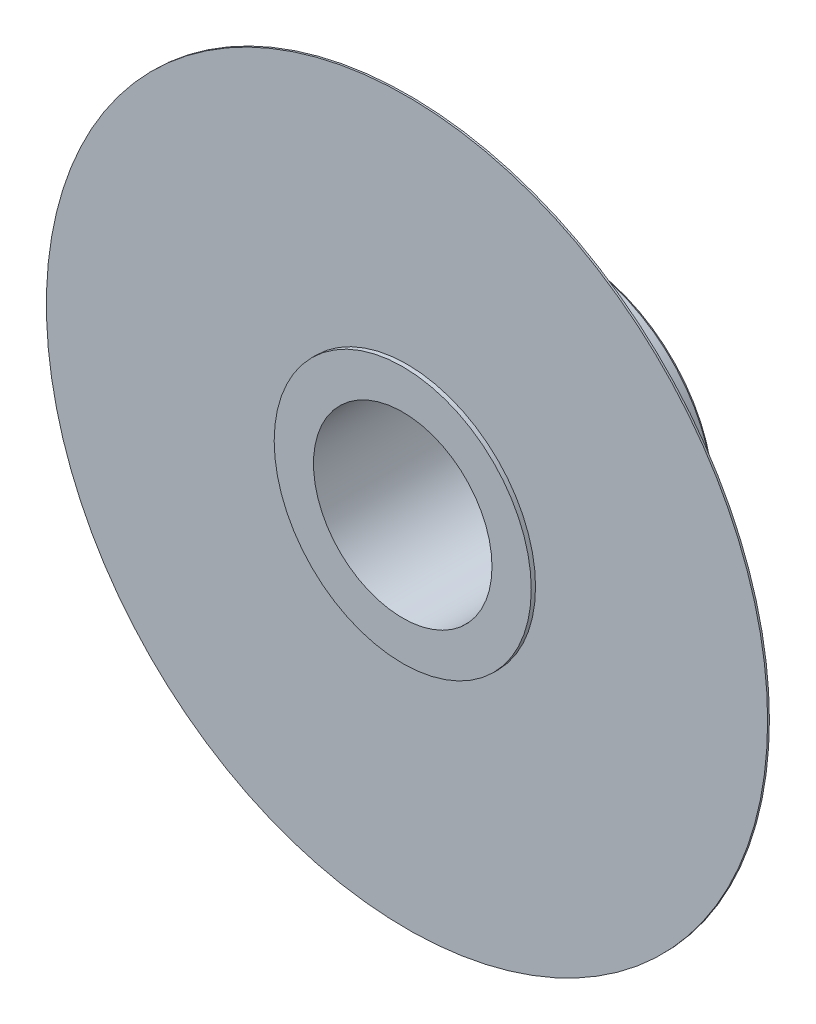
ISO-10303-21;
HEADER;
FILE_DESCRIPTION(('STEP AP214'),'2;1');
FILE_NAME('part.step','',(''),(''),'','','');
FILE_SCHEMA(('AUTOMOTIVE_DESIGN { 1 0 10303 214 1 1 1 1 }'));
ENDSEC;
DATA;
#1=APPLICATION_CONTEXT('core data for automotive mechanical design processes');
#2=APPLICATION_PROTOCOL_DEFINITION('international standard','automotive_design',2000,#1);
#3=PRODUCT_CONTEXT('',#1,'mechanical');
#4=PRODUCT('Part','Part','',(#3));
#5=PRODUCT_RELATED_PRODUCT_CATEGORY('part','',(#4));
#6=PRODUCT_DEFINITION_FORMATION('','',#4);
#7=PRODUCT_DEFINITION_CONTEXT('part definition',#1,'design');
#8=PRODUCT_DEFINITION('design','',#6,#7);
#9=PRODUCT_DEFINITION_SHAPE('','',#8);
#10=(LENGTH_UNIT() NAMED_UNIT(*) SI_UNIT(.MILLI.,.METRE.));
#11=(NAMED_UNIT(*) PLANE_ANGLE_UNIT() SI_UNIT($,.RADIAN.));
#12=(NAMED_UNIT(*) SI_UNIT($,.STERADIAN.) SOLID_ANGLE_UNIT());
#13=UNCERTAINTY_MEASURE_WITH_UNIT(LENGTH_MEASURE(1.E-05),#10,'distance_accuracy_value','');
#14=(GEOMETRIC_REPRESENTATION_CONTEXT(3) GLOBAL_UNCERTAINTY_ASSIGNED_CONTEXT((#13)) GLOBAL_UNIT_ASSIGNED_CONTEXT((#10,
#11,#12)) REPRESENTATION_CONTEXT('',''));
#15=CARTESIAN_POINT('',(0.,0.,0.));
#16=DIRECTION('',(0.,0.,1.));
#17=DIRECTION('',(1.,0.,0.));
#18=AXIS2_PLACEMENT_3D('',#15,#16,#17);
#19=CARTESIAN_POINT('',(0.,0.,0.));
#20=DIRECTION('',(0.,0.,-1.));
#21=DIRECTION('',(-1.,0.,0.));
#22=AXIS2_PLACEMENT_3D('',#19,#20,#21);
#23=CYLINDRICAL_SURFACE('',#22,5.08);
#24=CARTESIAN_POINT('',(0.,0.,1.8034));
#25=DIRECTION('',(0.,0.,-1.));
#26=DIRECTION('',(-1.,0.,0.));
#27=AXIS2_PLACEMENT_3D('',#24,#25,#26);
#28=CIRCLE('',#27,5.08);
#29=CARTESIAN_POINT('',(-5.08,0.,1.8034));
#30=VERTEX_POINT('',#29);
#31=EDGE_CURVE('E17',#30,#30,#28,.F.);
#32=ORIENTED_EDGE('',*,*,#31,.F.);
#33=EDGE_LOOP('',(#32));
#34=FACE_BOUND('',#33,.T.);
#35=CARTESIAN_POINT('',(0.,0.,0.12699999971675));
#36=DIRECTION('',(0.,0.,1.));
#37=DIRECTION('',(0.,-1.,0.));
#38=AXIS2_PLACEMENT_3D('',#35,#36,#37);
#39=CIRCLE('',#38,5.07999999971675);
#40=CARTESIAN_POINT('',(0.,-5.07999999971675,0.12699999971675));
#41=VERTEX_POINT('',#40);
#42=EDGE_CURVE('E29',#41,#41,#39,.F.);
#43=ORIENTED_EDGE('',*,*,#42,.F.);
#44=EDGE_LOOP('',(#43));
#45=FACE_BOUND('',#44,.T.);
#46=ADVANCED_FACE('F14',(#34,#45),#23,.T.);
#47=CARTESIAN_POINT('',(0.,0.,1.8034));
#48=DIRECTION('',(0.,0.,-1.));
#49=DIRECTION('',(-1.,0.,0.));
#50=AXIS2_PLACEMENT_3D('',#47,#48,#49);
#51=PLANE('',#50);
#52=ORIENTED_EDGE('',*,*,#31,.T.);
#53=EDGE_LOOP('',(#52));
#54=FACE_BOUND('',#53,.T.);
#55=CARTESIAN_POINT('',(0.,0.,1.80339999989161));
#56=DIRECTION('',(0.,0.,1.));
#57=DIRECTION('',(1.,0.,0.));
#58=AXIS2_PLACEMENT_3D('',#55,#56,#57);
#59=CIRCLE('',#58,5.84199999989161);
#60=CARTESIAN_POINT('',(5.84199999989161,0.,1.80339999989161));
#61=VERTEX_POINT('',#60);
#62=EDGE_CURVE('E49',#61,#61,#59,.T.);
#63=ORIENTED_EDGE('',*,*,#62,.F.);
#64=EDGE_LOOP('',(#63));
#65=FACE_BOUND('',#64,.T.);
#66=ADVANCED_FACE('F59',(#54,#65),#51,.T.);
#67=CARTESIAN_POINT('',(0.,0.,0.126999999716753));
#68=DIRECTION('',(0.,0.,1.));
#69=DIRECTION('',(1.,0.,0.));
#70=AXIS2_PLACEMENT_3D('',#67,#68,#69);
#71=CONICAL_SURFACE('',#70,5.07999999971675,0.785398163397435);
#72=ORIENTED_EDGE('',*,*,#42,.T.);
#73=EDGE_LOOP('',(#72));
#74=FACE_BOUND('',#73,.T.);
#75=CARTESIAN_POINT('',(0.,0.,-4.92099416771197E-10));
#76=DIRECTION('',(0.,0.,1.));
#77=DIRECTION('',(1.,0.,0.));
#78=AXIS2_PLACEMENT_3D('',#75,#76,#77);
#79=CIRCLE('',#78,4.9529999995079);
#80=CARTESIAN_POINT('',(4.9529999995079,0.,-4.92099416771197E-10));
#81=VERTEX_POINT('',#80);
#82=EDGE_CURVE('E47',#81,#81,#79,.T.);
#83=ORIENTED_EDGE('',*,*,#82,.T.);
#84=EDGE_LOOP('',(#83));
#85=FACE_BOUND('',#84,.T.);
#86=ADVANCED_FACE('F68',(#74,#85),#71,.T.);
#87=CARTESIAN_POINT('',(0.,0.,2.31139999986285));
#88=DIRECTION('',(0.,0.,1.));
#89=DIRECTION('',(1.,0.,0.));
#90=AXIS2_PLACEMENT_3D('',#87,#88,#89);
#91=CONICAL_SURFACE('',#90,6.34999999986285,0.785398163397448);
#92=ORIENTED_EDGE('',*,*,#62,.T.);
#93=EDGE_LOOP('',(#92));
#94=FACE_BOUND('',#93,.T.);
#95=CARTESIAN_POINT('',(0.,0.,2.3114));
#96=DIRECTION('',(0.,0.,-1.));
#97=DIRECTION('',(-1.,0.,0.));
#98=AXIS2_PLACEMENT_3D('',#95,#96,#97);
#99=CIRCLE('',#98,6.35);
#100=CARTESIAN_POINT('',(-6.35,0.,2.3114));
#101=VERTEX_POINT('',#100);
#102=EDGE_CURVE('E46',#101,#101,#99,.F.);
#103=ORIENTED_EDGE('',*,*,#102,.F.);
#104=EDGE_LOOP('',(#103));
#105=FACE_BOUND('',#104,.T.);
#106=ADVANCED_FACE('F103',(#94,#105),#91,.T.);
#107=CARTESIAN_POINT('',(0.,0.,0.));
#108=DIRECTION('',(0.,0.,1.));
#109=DIRECTION('',(1.,0.,0.));
#110=AXIS2_PLACEMENT_3D('',#107,#108,#109);
#111=PLANE('',#110);
#112=CARTESIAN_POINT('',(0.,0.,0.));
#113=DIRECTION('',(0.,0.,1.));
#114=DIRECTION('',(1.,0.,0.));
#115=AXIS2_PLACEMENT_3D('',#112,#113,#114);
#116=CIRCLE('',#115,3.175);
#117=CARTESIAN_POINT('',(3.175,0.,0.));
#118=VERTEX_POINT('',#117);
#119=EDGE_CURVE('E43',#118,#118,#116,.T.);
#120=ORIENTED_EDGE('',*,*,#119,.T.);
#121=EDGE_LOOP('',(#120));
#122=FACE_BOUND('',#121,.T.);
#123=ORIENTED_EDGE('',*,*,#82,.F.);
#124=EDGE_LOOP('',(#123));
#125=FACE_BOUND('',#124,.T.);
#126=ADVANCED_FACE('F99',(#122,#125),#111,.F.);
#127=CARTESIAN_POINT('',(0.,0.,0.));
#128=DIRECTION('',(0.,0.,-1.));
#129=DIRECTION('',(-1.,0.,0.));
#130=AXIS2_PLACEMENT_3D('',#127,#128,#129);
#131=CYLINDRICAL_SURFACE('',#130,6.35);
#132=CARTESIAN_POINT('',(0.,0.,5.8801));
#133=DIRECTION('',(0.,0.,-1.));
#134=DIRECTION('',(-1.,0.,0.));
#135=AXIS2_PLACEMENT_3D('',#132,#133,#134);
#136=CIRCLE('',#135,6.35);
#137=CARTESIAN_POINT('',(-6.35,0.,5.8801));
#138=VERTEX_POINT('',#137);
#139=EDGE_CURVE('E40',#138,#138,#136,.F.);
#140=ORIENTED_EDGE('',*,*,#139,.F.);
#141=EDGE_LOOP('',(#140));
#142=FACE_BOUND('',#141,.T.);
#143=ORIENTED_EDGE('',*,*,#102,.T.);
#144=EDGE_LOOP('',(#143));
#145=FACE_BOUND('',#144,.T.);
#146=ADVANCED_FACE('F95',(#142,#145),#131,.T.);
#147=CARTESIAN_POINT('',(0.,0.,6.096));
#148=DIRECTION('',(0.,0.,1.));
#149=DIRECTION('',(1.,0.,0.));
#150=AXIS2_PLACEMENT_3D('',#147,#148,#149);
#151=CYLINDRICAL_SURFACE('',#150,3.175);
#152=CARTESIAN_POINT('',(0.,0.,6.096));
#153=DIRECTION('',(0.,0.,1.));
#154=DIRECTION('',(1.,0.,0.));
#155=AXIS2_PLACEMENT_3D('',#152,#153,#154);
#156=CIRCLE('',#155,3.175);
#157=CARTESIAN_POINT('',(3.175,0.,6.096));
#158=VERTEX_POINT('',#157);
#159=EDGE_CURVE('E37',#158,#158,#156,.F.);
#160=ORIENTED_EDGE('',*,*,#159,.F.);
#161=EDGE_LOOP('',(#160));
#162=FACE_BOUND('',#161,.T.);
#163=ORIENTED_EDGE('',*,*,#119,.F.);
#164=EDGE_LOOP('',(#163));
#165=FACE_BOUND('',#164,.T.);
#166=ADVANCED_FACE('F91',(#162,#165),#151,.F.);
#167=CARTESIAN_POINT('',(0.,0.,5.8801));
#168=DIRECTION('',(0.,0.,-1.));
#169=DIRECTION('',(-1.,0.,0.));
#170=AXIS2_PLACEMENT_3D('',#167,#168,#169);
#171=PLANE('',#170);
#172=ORIENTED_EDGE('',*,*,#139,.T.);
#173=EDGE_LOOP('',(#172));
#174=FACE_BOUND('',#173,.T.);
#175=CARTESIAN_POINT('',(0.,0.,5.8801));
#176=DIRECTION('',(0.,0.,1.));
#177=DIRECTION('',(1.,0.,0.));
#178=AXIS2_PLACEMENT_3D('',#175,#176,#177);
#179=CIRCLE('',#178,12.827);
#180=CARTESIAN_POINT('',(12.827,0.,5.8801));
#181=VERTEX_POINT('',#180);
#182=EDGE_CURVE('E34',#181,#181,#179,.T.);
#183=ORIENTED_EDGE('',*,*,#182,.F.);
#184=EDGE_LOOP('',(#183));
#185=FACE_BOUND('',#184,.T.);
#186=ADVANCED_FACE('F87',(#174,#185),#171,.T.);
#187=CARTESIAN_POINT('',(0.,0.,6.096));
#188=DIRECTION('',(0.,0.,1.));
#189=DIRECTION('',(1.,0.,0.));
#190=AXIS2_PLACEMENT_3D('',#187,#188,#189);
#191=PLANE('',#190);
#192=ORIENTED_EDGE('',*,*,#159,.T.);
#193=EDGE_LOOP('',(#192));
#194=FACE_BOUND('',#193,.T.);
#195=CARTESIAN_POINT('',(0.,0.,6.096));
#196=DIRECTION('',(0.,0.,1.));
#197=DIRECTION('',(1.,0.,0.));
#198=AXIS2_PLACEMENT_3D('',#195,#196,#197);
#199=CIRCLE('',#198,4.572);
#200=CARTESIAN_POINT('',(4.572,0.,6.096));
#201=VERTEX_POINT('',#200);
#202=EDGE_CURVE('E26',#201,#201,#199,.F.);
#203=ORIENTED_EDGE('',*,*,#202,.F.);
#204=EDGE_LOOP('',(#203));
#205=FACE_BOUND('',#204,.T.);
#206=ADVANCED_FACE('F83',(#194,#205),#191,.T.);
#207=CARTESIAN_POINT('',(0.,0.,0.));
#208=DIRECTION('',(0.,0.,1.));
#209=DIRECTION('',(1.,0.,0.));
#210=AXIS2_PLACEMENT_3D('',#207,#208,#209);
#211=CYLINDRICAL_SURFACE('',#210,12.827);
#212=CARTESIAN_POINT('',(0.,0.,5.9436));
#213=DIRECTION('',(0.,0.,1.));
#214=DIRECTION('',(1.,0.,0.));
#215=AXIS2_PLACEMENT_3D('',#212,#213,#214);
#216=CIRCLE('',#215,12.827);
#217=CARTESIAN_POINT('',(12.827,0.,5.9436));
#218=VERTEX_POINT('',#217);
#219=EDGE_CURVE('E21',#218,#218,#216,.T.);
#220=ORIENTED_EDGE('',*,*,#219,.F.);
#221=EDGE_LOOP('',(#220));
#222=FACE_BOUND('',#221,.T.);
#223=ORIENTED_EDGE('',*,*,#182,.T.);
#224=EDGE_LOOP('',(#223));
#225=FACE_BOUND('',#224,.T.);
#226=ADVANCED_FACE('F76',(#222,#225),#211,.T.);
#227=CARTESIAN_POINT('',(0.,0.,5.9436));
#228=DIRECTION('',(0.,0.,1.));
#229=DIRECTION('',(1.,0.,0.));
#230=AXIS2_PLACEMENT_3D('',#227,#228,#229);
#231=CYLINDRICAL_SURFACE('',#230,4.572);
#232=ORIENTED_EDGE('',*,*,#202,.T.);
#233=EDGE_LOOP('',(#232));
#234=FACE_BOUND('',#233,.T.);
#235=CARTESIAN_POINT('',(0.,0.,5.9436));
#236=DIRECTION('',(0.,0.,1.));
#237=DIRECTION('',(1.,0.,0.));
#238=AXIS2_PLACEMENT_3D('',#235,#236,#237);
#239=CIRCLE('',#238,4.572);
#240=CARTESIAN_POINT('',(4.572,0.,5.9436));
#241=VERTEX_POINT('',#240);
#242=EDGE_CURVE('E10',#241,#241,#239,.F.);
#243=ORIENTED_EDGE('',*,*,#242,.F.);
#244=EDGE_LOOP('',(#243));
#245=FACE_BOUND('',#244,.T.);
#246=ADVANCED_FACE('F71',(#234,#245),#231,.T.);
#247=CARTESIAN_POINT('',(0.,0.,5.9436));
#248=DIRECTION('',(0.,0.,1.));
#249=DIRECTION('',(1.,0.,0.));
#250=AXIS2_PLACEMENT_3D('',#247,#248,#249);
#251=PLANE('',#250);
#252=ORIENTED_EDGE('',*,*,#242,.T.);
#253=EDGE_LOOP('',(#252));
#254=FACE_BOUND('',#253,.T.);
#255=ORIENTED_EDGE('',*,*,#219,.T.);
#256=EDGE_LOOP('',(#255));
#257=FACE_BOUND('',#256,.T.);
#258=ADVANCED_FACE('F69',(#254,#257),#251,.T.);
#259=CLOSED_SHELL('',(#46,#66,#86,#106,#126,#146,#166,#186,#206,#226,#246,#258));
#260=MANIFOLD_SOLID_BREP('B1',#259);
#261=ADVANCED_BREP_SHAPE_REPRESENTATION('',(#18,#260),#14);
#262=SHAPE_DEFINITION_REPRESENTATION(#9,#261);
ENDSEC;
END-ISO-10303-21;
